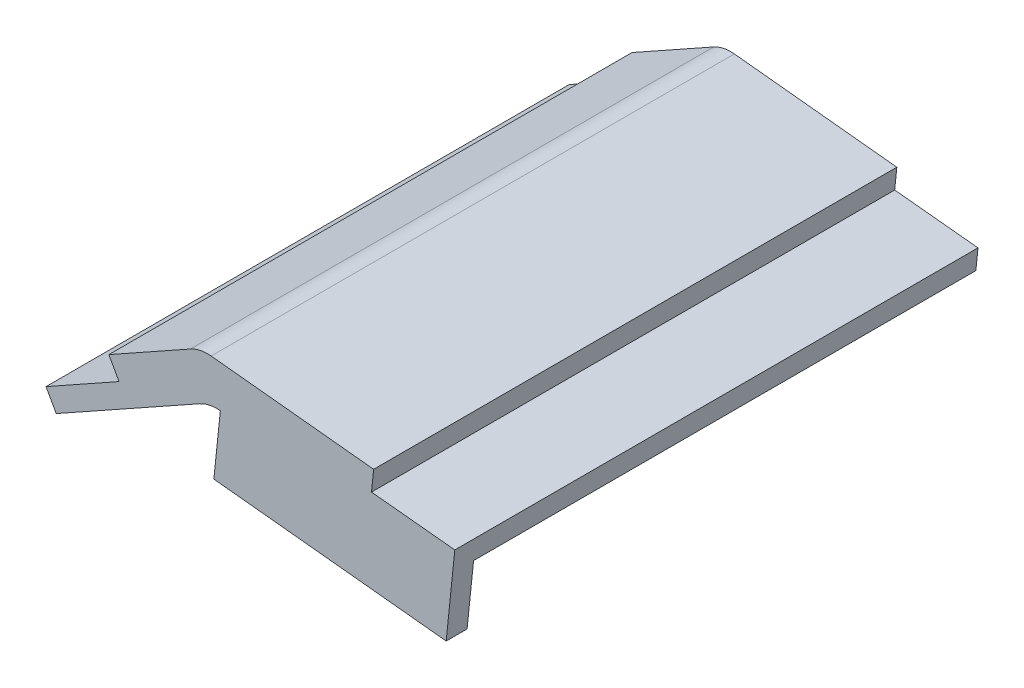
ISO-10303-21;
HEADER;
FILE_DESCRIPTION(('STEP AP214'),'2;1');
FILE_NAME('part.step','',(''),(''),'','','');
FILE_SCHEMA(('AUTOMOTIVE_DESIGN { 1 0 10303 214 1 1 1 1 }'));
ENDSEC;
DATA;
#1=APPLICATION_CONTEXT('core data for automotive mechanical design processes');
#2=APPLICATION_PROTOCOL_DEFINITION('international standard','automotive_design',2000,#1);
#3=PRODUCT_CONTEXT('',#1,'mechanical');
#4=PRODUCT('Part','Part','',(#3));
#5=PRODUCT_RELATED_PRODUCT_CATEGORY('part','',(#4));
#6=PRODUCT_DEFINITION_FORMATION('','',#4);
#7=PRODUCT_DEFINITION_CONTEXT('part definition',#1,'design');
#8=PRODUCT_DEFINITION('design','',#6,#7);
#9=PRODUCT_DEFINITION_SHAPE('','',#8);
#10=(LENGTH_UNIT() NAMED_UNIT(*) SI_UNIT(.MILLI.,.METRE.));
#11=(NAMED_UNIT(*) PLANE_ANGLE_UNIT() SI_UNIT($,.RADIAN.));
#12=(NAMED_UNIT(*) SI_UNIT($,.STERADIAN.) SOLID_ANGLE_UNIT());
#13=UNCERTAINTY_MEASURE_WITH_UNIT(LENGTH_MEASURE(1.E-05),#10,'distance_accuracy_value','');
#14=(GEOMETRIC_REPRESENTATION_CONTEXT(3) GLOBAL_UNCERTAINTY_ASSIGNED_CONTEXT((#13)) GLOBAL_UNIT_ASSIGNED_CONTEXT((#10,
#11,#12)) REPRESENTATION_CONTEXT('',''));
#15=CARTESIAN_POINT('',(0.,0.,0.));
#16=DIRECTION('',(0.,0.,1.));
#17=DIRECTION('',(1.,0.,0.));
#18=AXIS2_PLACEMENT_3D('',#15,#16,#17);
#19=CARTESIAN_POINT('',(27.5598014631692,14.6435706363407,75.));
#20=DIRECTION('',(0.103231615139367,0.994657344835757,0.));
#21=DIRECTION('',(-0.994657344835757,0.103231615139367,0.));
#22=AXIS2_PLACEMENT_3D('',#19,#20,#21);
#23=PLANE('',#22);
#24=DIRECTION('',(0.994657344835757,-0.103231615139367,0.));
#25=VECTOR('',#24,1.);
#26=CARTESIAN_POINT('',(27.5598014631692,14.6435706363407,72.));
#27=LINE('',#26,#25);
#28=CARTESIAN_POINT('',(27.5598014631692,14.6435706363407,72.));
#29=VERTEX_POINT('',#28);
#30=CARTESIAN_POINT('',(60.8607098876166,11.1873989405176,72.));
#31=VERTEX_POINT('',#30);
#32=EDGE_CURVE('E432',#29,#31,#27,.T.);
#33=ORIENTED_EDGE('',*,*,#32,.F.);
#34=DIRECTION('',(0.,0.,-1.));
#35=VECTOR('',#34,1.);
#36=CARTESIAN_POINT('',(27.5598014631692,14.6435706363407,75.));
#37=LINE('',#36,#35);
#38=CARTESIAN_POINT('',(27.5598014631692,14.6435706363407,0.));
#39=VERTEX_POINT('',#38);
#40=EDGE_CURVE('E214',#29,#39,#37,.T.);
#41=ORIENTED_EDGE('',*,*,#40,.T.);
#42=DIRECTION('',(0.994657344835757,-0.103231615139367,0.));
#43=VECTOR('',#42,1.);
#44=CARTESIAN_POINT('',(27.5598014631692,14.6435706363407,0.));
#45=LINE('',#44,#43);
#46=CARTESIAN_POINT('',(60.8607098876166,11.1873989405176,0.));
#47=VERTEX_POINT('',#46);
#48=EDGE_CURVE('E184',#39,#47,#45,.T.);
#49=ORIENTED_EDGE('',*,*,#48,.T.);
#50=DIRECTION('',(0.,0.,-1.));
#51=VECTOR('',#50,1.);
#52=CARTESIAN_POINT('',(60.8607098876166,11.1873989405176,75.));
#53=LINE('',#52,#51);
#54=EDGE_CURVE('E211',#31,#47,#53,.T.);
#55=ORIENTED_EDGE('',*,*,#54,.F.);
#56=EDGE_LOOP('',(#33,#41,#49,#55));
#57=FACE_BOUND('',#56,.T.);
#58=ADVANCED_FACE('F39',(#57),#23,.F.);
#59=CARTESIAN_POINT('',(11.575975538502,13.6218112800279,75.));
#60=DIRECTION('',(0.488204604461283,-0.872729204382896,0.));
#61=DIRECTION('',(0.872729204382896,0.488204604461283,0.));
#62=AXIS2_PLACEMENT_3D('',#59,#60,#61);
#63=PLANE('',#62);
#64=DIRECTION('',(-0.872729204382896,-0.488204604461283,0.));
#65=VECTOR('',#64,1.);
#66=CARTESIAN_POINT('',(11.575975538502,13.6218112800279,0.));
#67=LINE('',#66,#65);
#68=CARTESIAN_POINT('',(23.2848653572146,20.1717627356657,0.));
#69=VERTEX_POINT('',#68);
#70=CARTESIAN_POINT('',(11.575975538502,13.6218112800279,0.));
#71=VERTEX_POINT('',#70);
#72=EDGE_CURVE('E163',#69,#71,#67,.T.);
#73=ORIENTED_EDGE('',*,*,#72,.T.);
#74=DIRECTION('',(0.,0.,-1.));
#75=VECTOR('',#74,1.);
#76=CARTESIAN_POINT('',(11.575975538502,13.6218112800279,75.));
#77=LINE('',#76,#75);
#78=CARTESIAN_POINT('',(11.575975538502,13.6218112800279,75.));
#79=VERTEX_POINT('',#78);
#80=EDGE_CURVE('E11',#79,#71,#77,.T.);
#81=ORIENTED_EDGE('',*,*,#80,.F.);
#82=DIRECTION('',(-0.872729204382896,-0.488204604461283,0.));
#83=VECTOR('',#82,1.);
#84=CARTESIAN_POINT('',(11.575975538502,13.6218112800279,75.));
#85=LINE('',#84,#83);
#86=CARTESIAN_POINT('',(23.2848653572146,20.1717627356657,75.));
#87=VERTEX_POINT('',#86);
#88=EDGE_CURVE('E200',#87,#79,#85,.T.);
#89=ORIENTED_EDGE('',*,*,#88,.F.);
#90=DIRECTION('',(0.,0.,-1.));
#91=VECTOR('',#90,1.);
#92=CARTESIAN_POINT('',(23.2848653572146,20.1717627356657,75.));
#93=LINE('',#92,#91);
#94=EDGE_CURVE('E159',#87,#69,#93,.T.);
#95=ORIENTED_EDGE('',*,*,#94,.T.);
#96=EDGE_LOOP('',(#73,#81,#89,#95));
#97=FACE_BOUND('',#96,.T.);
#98=ADVANCED_FACE('F41',(#97),#63,.F.);
#99=CARTESIAN_POINT('',(11.575975538502,13.6218112800279,75.));
#100=DIRECTION('',(0.872729204382896,0.488204604461283,0.));
#101=DIRECTION('',(-0.488204604461283,0.872729204382896,0.));
#102=AXIS2_PLACEMENT_3D('',#99,#100,#101);
#103=PLANE('',#102);
#104=DIRECTION('',(0.488204604461283,-0.872729204382896,0.));
#105=VECTOR('',#104,1.);
#106=CARTESIAN_POINT('',(11.575975538502,13.6218112800279,0.));
#107=LINE('',#106,#105);
#108=CARTESIAN_POINT('',(13.0405893518858,11.0036236668792,0.));
#109=VERTEX_POINT('',#108);
#110=EDGE_CURVE('E167',#71,#109,#107,.T.);
#111=ORIENTED_EDGE('',*,*,#110,.T.);
#112=DIRECTION('',(0.,0.,-1.));
#113=VECTOR('',#112,1.);
#114=CARTESIAN_POINT('',(13.0405893518858,11.0036236668792,75.));
#115=LINE('',#114,#113);
#116=CARTESIAN_POINT('',(13.0405893518858,11.0036236668792,75.));
#117=VERTEX_POINT('',#116);
#118=EDGE_CURVE('E49',#117,#109,#115,.T.);
#119=ORIENTED_EDGE('',*,*,#118,.F.);
#120=DIRECTION('',(0.488204604461283,-0.872729204382896,0.));
#121=VECTOR('',#120,1.);
#122=CARTESIAN_POINT('',(11.575975538502,13.6218112800279,75.));
#123=LINE('',#122,#121);
#124=EDGE_CURVE('E113',#79,#117,#123,.T.);
#125=ORIENTED_EDGE('',*,*,#124,.F.);
#126=ORIENTED_EDGE('',*,*,#80,.T.);
#127=EDGE_LOOP('',(#111,#119,#125,#126));
#128=FACE_BOUND('',#127,.T.);
#129=ADVANCED_FACE('F302',(#128),#103,.F.);
#130=CARTESIAN_POINT('',(13.0405893518858,11.0036236668792,75.));
#131=DIRECTION('',(0.488204604461283,-0.872729204382896,0.));
#132=DIRECTION('',(0.872729204382896,0.488204604461283,0.));
#133=AXIS2_PLACEMENT_3D('',#130,#131,#132);
#134=PLANE('',#133);
#135=DIRECTION('',(-0.872729204382896,-0.488204604461283,0.));
#136=VECTOR('',#135,1.);
#137=CARTESIAN_POINT('',(13.0405893518858,11.0036236668792,0.));
#138=LINE('',#137,#136);
#139=CARTESIAN_POINT('',(2.56783889929108,5.14516841334378,0.));
#140=VERTEX_POINT('',#139);
#141=EDGE_CURVE('E171',#109,#140,#138,.T.);
#142=ORIENTED_EDGE('',*,*,#141,.T.);
#143=DIRECTION('',(0.,0.,-1.));
#144=VECTOR('',#143,1.);
#145=CARTESIAN_POINT('',(2.56783889929108,5.14516841334378,75.));
#146=LINE('',#145,#144);
#147=CARTESIAN_POINT('',(2.56783889929108,5.14516841334378,75.));
#148=VERTEX_POINT('',#147);
#149=EDGE_CURVE('E227',#148,#140,#146,.T.);
#150=ORIENTED_EDGE('',*,*,#149,.F.);
#151=DIRECTION('',(-0.872729204382896,-0.488204604461283,0.));
#152=VECTOR('',#151,1.);
#153=CARTESIAN_POINT('',(13.0405893518858,11.0036236668792,75.));
#154=LINE('',#153,#152);
#155=EDGE_CURVE('E237',#117,#148,#154,.T.);
#156=ORIENTED_EDGE('',*,*,#155,.F.);
#157=ORIENTED_EDGE('',*,*,#118,.T.);
#158=EDGE_LOOP('',(#142,#150,#156,#157));
#159=FACE_BOUND('',#158,.T.);
#160=ADVANCED_FACE('F235',(#159),#134,.F.);
#161=CARTESIAN_POINT('',(2.56783889929108,5.14516841334378,75.));
#162=DIRECTION('',(0.872729204382901,0.488204604461273,0.));
#163=DIRECTION('',(-0.488204604461273,0.872729204382901,0.));
#164=AXIS2_PLACEMENT_3D('',#161,#162,#163);
#165=PLANE('',#164);
#166=DIRECTION('',(0.488204604461273,-0.872729204382901,0.));
#167=VECTOR('',#166,1.);
#168=CARTESIAN_POINT('',(2.56783889929108,5.14516841334378,0.));
#169=LINE('',#168,#167);
#170=CARTESIAN_POINT('',(4.0324527126749,2.52698080019508,0.));
#171=VERTEX_POINT('',#170);
#172=EDGE_CURVE('E174',#140,#171,#169,.T.);
#173=ORIENTED_EDGE('',*,*,#172,.T.);
#174=DIRECTION('',(0.,0.,-1.));
#175=VECTOR('',#174,1.);
#176=CARTESIAN_POINT('',(4.0324527126749,2.52698080019508,75.));
#177=LINE('',#176,#175);
#178=CARTESIAN_POINT('',(4.0324527126749,2.52698080019508,75.));
#179=VERTEX_POINT('',#178);
#180=EDGE_CURVE('E223',#179,#171,#177,.T.);
#181=ORIENTED_EDGE('',*,*,#180,.F.);
#182=DIRECTION('',(0.488204604461273,-0.872729204382901,0.));
#183=VECTOR('',#182,1.);
#184=CARTESIAN_POINT('',(2.56783889929108,5.14516841334378,75.));
#185=LINE('',#184,#183);
#186=EDGE_CURVE('E257',#148,#179,#185,.T.);
#187=ORIENTED_EDGE('',*,*,#186,.F.);
#188=ORIENTED_EDGE('',*,*,#149,.T.);
#189=EDGE_LOOP('',(#173,#181,#187,#188));
#190=FACE_BOUND('',#189,.T.);
#191=ADVANCED_FACE('F246',(#190),#165,.F.);
#192=CARTESIAN_POINT('',(4.0324527126749,2.52698080019508,75.));
#193=DIRECTION('',(-0.488204604461283,0.872729204382895,0.));
#194=DIRECTION('',(-0.872729204382895,-0.488204604461283,0.));
#195=AXIS2_PLACEMENT_3D('',#192,#193,#194);
#196=PLANE('',#195);
#197=DIRECTION('',(0.872729204382895,0.488204604461283,0.));
#198=VECTOR('',#197,1.);
#199=CARTESIAN_POINT('',(4.0324527126749,2.52698080019508,0.));
#200=LINE('',#199,#198);
#201=CARTESIAN_POINT('',(24.602620365166,14.0339299340764,0.));
#202=VERTEX_POINT('',#201);
#203=EDGE_CURVE('E177',#171,#202,#200,.T.);
#204=ORIENTED_EDGE('',*,*,#203,.T.);
#205=DIRECTION('',(0.,0.,-1.));
#206=VECTOR('',#205,1.);
#207=CARTESIAN_POINT('',(24.602620365166,14.0339299340764,75.));
#208=LINE('',#207,#206);
#209=CARTESIAN_POINT('',(24.602620365166,14.0339299340764,75.));
#210=VERTEX_POINT('',#209);
#211=EDGE_CURVE('E219',#210,#202,#208,.T.);
#212=ORIENTED_EDGE('',*,*,#211,.F.);
#213=DIRECTION('',(0.872729204382895,0.488204604461283,0.));
#214=VECTOR('',#213,1.);
#215=CARTESIAN_POINT('',(4.0324527126749,2.52698080019508,75.));
#216=LINE('',#215,#214);
#217=EDGE_CURVE('E252',#179,#210,#216,.T.);
#218=ORIENTED_EDGE('',*,*,#217,.F.);
#219=ORIENTED_EDGE('',*,*,#180,.T.);
#220=EDGE_LOOP('',(#204,#212,#218,#219));
#221=FACE_BOUND('',#220,.T.);
#222=ADVANCED_FACE('F250',(#221),#196,.F.);
#223=CARTESIAN_POINT('',(27.0436433874724,9.67028391216185,75.));
#224=DIRECTION('',(0.,0.,-1.));
#225=DIRECTION('',(-1.,0.,0.));
#226=AXIS2_PLACEMENT_3D('',#223,#224,#225);
#227=CYLINDRICAL_SURFACE('',#226,5.00000000000006);
#228=CARTESIAN_POINT('',(27.0436433874724,9.67028391216185,0.));
#229=DIRECTION('',(0.,0.,-1.));
#230=DIRECTION('',(1.,0.,0.));
#231=AXIS2_PLACEMENT_3D('',#228,#229,#230);
#232=CIRCLE('',#231,5.00000000000006);
#233=EDGE_CURVE('E180',#202,#39,#232,.T.);
#234=ORIENTED_EDGE('',*,*,#233,.T.);
#235=ORIENTED_EDGE('',*,*,#40,.F.);
#236=CARTESIAN_POINT('',(27.5598014631692,14.6435706363407,75.));
#237=VERTEX_POINT('',#236);
#238=EDGE_CURVE('E215',#237,#29,#37,.T.);
#239=ORIENTED_EDGE('',*,*,#238,.F.);
#240=CARTESIAN_POINT('',(27.0436433874724,9.67028391216185,75.));
#241=DIRECTION('',(0.,0.,-1.));
#242=DIRECTION('',(1.,0.,0.));
#243=AXIS2_PLACEMENT_3D('',#240,#241,#242);
#244=CIRCLE('',#243,5.00000000000006);
#245=EDGE_CURVE('E256',#210,#237,#244,.T.);
#246=ORIENTED_EDGE('',*,*,#245,.F.);
#247=ORIENTED_EDGE('',*,*,#211,.T.);
#248=EDGE_LOOP('',(#234,#235,#239,#246,#247));
#249=FACE_BOUND('',#248,.T.);
#250=ADVANCED_FACE('F307',(#249),#227,.F.);
#251=CARTESIAN_POINT('',(61.1704047330347,14.1713709750249,75.));
#252=DIRECTION('',(-0.994657344835757,0.103231615139368,0.));
#253=DIRECTION('',(-0.103231615139368,-0.994657344835757,0.));
#254=AXIS2_PLACEMENT_3D('',#251,#252,#253);
#255=PLANE('',#254);
#256=DIRECTION('',(0.103231615139368,0.994657344835757,0.));
#257=VECTOR('',#256,1.);
#258=CARTESIAN_POINT('',(61.1704047330347,14.1713709750249,0.));
#259=LINE('',#258,#257);
#260=CARTESIAN_POINT('',(61.1704047330347,14.1713709750249,0.));
#261=VERTEX_POINT('',#260);
#262=EDGE_CURVE('E188',#47,#261,#259,.T.);
#263=ORIENTED_EDGE('',*,*,#262,.T.);
#264=DIRECTION('',(0.,0.,-1.));
#265=VECTOR('',#264,1.);
#266=CARTESIAN_POINT('',(61.1704047330347,14.1713709750249,75.));
#267=LINE('',#266,#265);
#268=CARTESIAN_POINT('',(61.1704047330347,14.1713709750249,75.));
#269=VERTEX_POINT('',#268);
#270=EDGE_CURVE('E207',#269,#261,#267,.T.);
#271=ORIENTED_EDGE('',*,*,#270,.F.);
#272=DIRECTION('',(0.103231615139368,0.994657344835757,0.));
#273=VECTOR('',#272,1.);
#274=CARTESIAN_POINT('',(61.1704047330347,14.1713709750249,75.));
#275=LINE('',#274,#273);
#276=CARTESIAN_POINT('',(59.9316253513623,2.23548283699584,75.));
#277=VERTEX_POINT('',#276);
#278=EDGE_CURVE('E261',#277,#269,#275,.T.);
#279=ORIENTED_EDGE('',*,*,#278,.F.);
#280=DIRECTION('',(0.,0.,1.));
#281=VECTOR('',#280,1.);
#282=CARTESIAN_POINT('',(59.9316253513623,2.23548283699584,75.));
#283=LINE('',#282,#281);
#284=CARTESIAN_POINT('',(59.9316253513623,2.23548283699584,72.));
#285=VERTEX_POINT('',#284);
#286=EDGE_CURVE('E457',#285,#277,#283,.T.);
#287=ORIENTED_EDGE('',*,*,#286,.F.);
#288=DIRECTION('',(0.103231615139367,0.994657344835757,0.));
#289=VECTOR('',#288,1.);
#290=CARTESIAN_POINT('',(59.9316253513623,2.23548283699584,72.));
#291=LINE('',#290,#289);
#292=EDGE_CURVE('E439',#285,#31,#291,.T.);
#293=ORIENTED_EDGE('',*,*,#292,.T.);
#294=ORIENTED_EDGE('',*,*,#54,.T.);
#295=EDGE_LOOP('',(#263,#271,#279,#287,#293,#294));
#296=FACE_BOUND('',#295,.T.);
#297=ADVANCED_FACE('F278',(#296),#255,.F.);
#298=CARTESIAN_POINT('',(49.2313579036183,15.3793282611088,75.));
#299=DIRECTION('',(-0.100663107173661,-0.99492056911803,0.));
#300=DIRECTION('',(0.99492056911803,-0.100663107173661,0.));
#301=AXIS2_PLACEMENT_3D('',#298,#299,#300);
#302=PLANE('',#301);
#303=DIRECTION('',(-0.99492056911803,0.100663107173661,0.));
#304=VECTOR('',#303,1.);
#305=CARTESIAN_POINT('',(49.2313579036183,15.3793282611088,0.));
#306=LINE('',#305,#304);
#307=CARTESIAN_POINT('',(49.2313579036183,15.3793282611088,0.));
#308=VERTEX_POINT('',#307);
#309=EDGE_CURVE('E191',#261,#308,#306,.T.);
#310=ORIENTED_EDGE('',*,*,#309,.T.);
#311=DIRECTION('',(0.,0.,-1.));
#312=VECTOR('',#311,1.);
#313=CARTESIAN_POINT('',(49.2313579036183,15.3793282611088,75.));
#314=LINE('',#313,#312);
#315=CARTESIAN_POINT('',(49.2313579036183,15.3793282611088,75.));
#316=VERTEX_POINT('',#315);
#317=EDGE_CURVE('E152',#316,#308,#314,.T.);
#318=ORIENTED_EDGE('',*,*,#317,.F.);
#319=DIRECTION('',(-0.99492056911803,0.100663107173661,0.));
#320=VECTOR('',#319,1.);
#321=CARTESIAN_POINT('',(49.2313579036183,15.3793282611088,75.));
#322=LINE('',#321,#320);
#323=EDGE_CURVE('E141',#269,#316,#322,.T.);
#324=ORIENTED_EDGE('',*,*,#323,.F.);
#325=ORIENTED_EDGE('',*,*,#270,.T.);
#326=EDGE_LOOP('',(#310,#318,#324,#325));
#327=FACE_BOUND('',#326,.T.);
#328=ADVANCED_FACE('F282',(#327),#302,.F.);
#329=CARTESIAN_POINT('',(49.5333472251393,18.3640899684629,75.));
#330=DIRECTION('',(-0.99492056911803,0.100663107173662,0.));
#331=DIRECTION('',(-0.100663107173662,-0.99492056911803,0.));
#332=AXIS2_PLACEMENT_3D('',#329,#330,#331);
#333=PLANE('',#332);
#334=DIRECTION('',(0.100663107173662,0.99492056911803,0.));
#335=VECTOR('',#334,1.);
#336=CARTESIAN_POINT('',(49.5333472251393,18.3640899684629,0.));
#337=LINE('',#336,#335);
#338=CARTESIAN_POINT('',(49.5333472251393,18.3640899684629,0.));
#339=VERTEX_POINT('',#338);
#340=EDGE_CURVE('E150',#308,#339,#337,.T.);
#341=ORIENTED_EDGE('',*,*,#340,.T.);
#342=DIRECTION('',(0.,0.,-1.));
#343=VECTOR('',#342,1.);
#344=CARTESIAN_POINT('',(49.5333472251393,18.3640899684629,75.));
#345=LINE('',#344,#343);
#346=CARTESIAN_POINT('',(49.5333472251393,18.3640899684629,75.));
#347=VERTEX_POINT('',#346);
#348=EDGE_CURVE('E147',#347,#339,#345,.T.);
#349=ORIENTED_EDGE('',*,*,#348,.F.);
#350=DIRECTION('',(0.100663107173662,0.99492056911803,0.));
#351=VECTOR('',#350,1.);
#352=CARTESIAN_POINT('',(49.5333472251393,18.3640899684629,75.));
#353=LINE('',#352,#351);
#354=EDGE_CURVE('E135',#316,#347,#353,.T.);
#355=ORIENTED_EDGE('',*,*,#354,.F.);
#356=ORIENTED_EDGE('',*,*,#317,.T.);
#357=EDGE_LOOP('',(#341,#349,#355,#356));
#358=FACE_BOUND('',#357,.T.);
#359=ADVANCED_FACE('F148',(#358),#333,.F.);
#360=CARTESIAN_POINT('',(26.2420464552179,20.7814034379299,75.));
#361=DIRECTION('',(-0.103231615139367,-0.994657344835757,0.));
#362=DIRECTION('',(0.994657344835757,-0.103231615139367,0.));
#363=AXIS2_PLACEMENT_3D('',#360,#361,#362);
#364=PLANE('',#363);
#365=DIRECTION('',(-0.994657344835757,0.103231615139367,0.));
#366=VECTOR('',#365,1.);
#367=CARTESIAN_POINT('',(26.2420464552179,20.7814034379299,0.));
#368=LINE('',#367,#366);
#369=CARTESIAN_POINT('',(26.2420464552179,20.7814034379299,0.));
#370=VERTEX_POINT('',#369);
#371=EDGE_CURVE('E99',#339,#370,#368,.T.);
#372=ORIENTED_EDGE('',*,*,#371,.T.);
#373=DIRECTION('',(0.,0.,-1.));
#374=VECTOR('',#373,1.);
#375=CARTESIAN_POINT('',(26.2420464552179,20.7814034379299,75.));
#376=LINE('',#375,#374);
#377=CARTESIAN_POINT('',(26.2420464552179,20.7814034379299,75.));
#378=VERTEX_POINT('',#377);
#379=EDGE_CURVE('E153',#378,#370,#376,.T.);
#380=ORIENTED_EDGE('',*,*,#379,.F.);
#381=DIRECTION('',(-0.994657344835757,0.103231615139367,0.));
#382=VECTOR('',#381,1.);
#383=CARTESIAN_POINT('',(26.2420464552179,20.7814034379299,75.));
#384=LINE('',#383,#382);
#385=EDGE_CURVE('E139',#347,#378,#384,.T.);
#386=ORIENTED_EDGE('',*,*,#385,.F.);
#387=ORIENTED_EDGE('',*,*,#348,.T.);
#388=EDGE_LOOP('',(#372,#380,#386,#387));
#389=FACE_BOUND('',#388,.T.);
#390=ADVANCED_FACE('F155',(#389),#364,.F.);
#391=CARTESIAN_POINT('',(25.725888379521,15.8081167137511,75.));
#392=DIRECTION('',(0.,0.,-1.));
#393=DIRECTION('',(-1.,0.,0.));
#394=AXIS2_PLACEMENT_3D('',#391,#392,#393);
#395=CYLINDRICAL_SURFACE('',#394,5.00000000000006);
#396=CARTESIAN_POINT('',(25.725888379521,15.8081167137511,0.));
#397=DIRECTION('',(0.,0.,1.));
#398=DIRECTION('',(1.,0.,0.));
#399=AXIS2_PLACEMENT_3D('',#396,#397,#398);
#400=CIRCLE('',#399,5.00000000000006);
#401=EDGE_CURVE('E105',#370,#69,#400,.T.);
#402=ORIENTED_EDGE('',*,*,#401,.T.);
#403=ORIENTED_EDGE('',*,*,#94,.F.);
#404=CARTESIAN_POINT('',(25.725888379521,15.8081167137511,75.));
#405=DIRECTION('',(0.,0.,1.));
#406=DIRECTION('',(1.,0.,0.));
#407=AXIS2_PLACEMENT_3D('',#404,#405,#406);
#408=CIRCLE('',#407,5.00000000000006);
#409=EDGE_CURVE('E57',#378,#87,#408,.T.);
#410=ORIENTED_EDGE('',*,*,#409,.F.);
#411=ORIENTED_EDGE('',*,*,#379,.T.);
#412=EDGE_LOOP('',(#402,#403,#410,#411));
#413=FACE_BOUND('',#412,.T.);
#414=ADVANCED_FACE('F286',(#413),#395,.T.);
#415=CARTESIAN_POINT('',(25.725888379521,15.8081167137511,75.));
#416=DIRECTION('',(0.,0.,1.));
#417=DIRECTION('',(1.,0.,0.));
#418=AXIS2_PLACEMENT_3D('',#415,#416,#417);
#419=PLANE('',#418);
#420=ORIENTED_EDGE('',*,*,#88,.T.);
#421=ORIENTED_EDGE('',*,*,#124,.T.);
#422=ORIENTED_EDGE('',*,*,#155,.T.);
#423=ORIENTED_EDGE('',*,*,#186,.T.);
#424=ORIENTED_EDGE('',*,*,#217,.T.);
#425=ORIENTED_EDGE('',*,*,#245,.T.);
#426=DIRECTION('',(0.103231615139367,0.994657344835757,0.));
#427=VECTOR('',#426,1.);
#428=CARTESIAN_POINT('',(26.6307169269149,5.6916545328189,75.));
#429=LINE('',#428,#427);
#430=CARTESIAN_POINT('',(26.6307169269149,5.6916545328189,75.));
#431=VERTEX_POINT('',#430);
#432=EDGE_CURVE('E443',#431,#237,#429,.T.);
#433=ORIENTED_EDGE('',*,*,#432,.F.);
#434=DIRECTION('',(-0.994657344835757,0.103231615139367,0.));
#435=VECTOR('',#434,1.);
#436=CARTESIAN_POINT('',(26.6307169269149,5.6916545328189,75.));
#437=LINE('',#436,#435);
#438=EDGE_CURVE('E274',#277,#431,#437,.T.);
#439=ORIENTED_EDGE('',*,*,#438,.F.);
#440=ORIENTED_EDGE('',*,*,#278,.T.);
#441=ORIENTED_EDGE('',*,*,#323,.T.);
#442=ORIENTED_EDGE('',*,*,#354,.T.);
#443=ORIENTED_EDGE('',*,*,#385,.T.);
#444=ORIENTED_EDGE('',*,*,#409,.T.);
#445=EDGE_LOOP('',(#420,#421,#422,#423,#424,#425,#433,#439,#440,#441,#442,#443,#444));
#446=FACE_BOUND('',#445,.T.);
#447=ADVANCED_FACE('F137',(#446),#419,.T.);
#448=CARTESIAN_POINT('',(25.725888379521,15.8081167137511,0.));
#449=DIRECTION('',(0.,0.,1.));
#450=DIRECTION('',(1.,0.,0.));
#451=AXIS2_PLACEMENT_3D('',#448,#449,#450);
#452=PLANE('',#451);
#453=ORIENTED_EDGE('',*,*,#72,.F.);
#454=ORIENTED_EDGE('',*,*,#401,.F.);
#455=ORIENTED_EDGE('',*,*,#371,.F.);
#456=ORIENTED_EDGE('',*,*,#340,.F.);
#457=ORIENTED_EDGE('',*,*,#309,.F.);
#458=ORIENTED_EDGE('',*,*,#262,.F.);
#459=ORIENTED_EDGE('',*,*,#48,.F.);
#460=ORIENTED_EDGE('',*,*,#233,.F.);
#461=ORIENTED_EDGE('',*,*,#203,.F.);
#462=ORIENTED_EDGE('',*,*,#172,.F.);
#463=ORIENTED_EDGE('',*,*,#141,.F.);
#464=ORIENTED_EDGE('',*,*,#110,.F.);
#465=EDGE_LOOP('',(#453,#454,#455,#456,#457,#458,#459,#460,#461,#462,#463,#464));
#466=FACE_BOUND('',#465,.T.);
#467=ADVANCED_FACE('F241',(#466),#452,.F.);
#468=CARTESIAN_POINT('',(26.6307169269149,5.6916545328189,75.));
#469=DIRECTION('',(0.994657344835757,-0.103231615139367,0.));
#470=DIRECTION('',(0.103231615139367,0.994657344835757,0.));
#471=AXIS2_PLACEMENT_3D('',#468,#469,#470);
#472=PLANE('',#471);
#473=ORIENTED_EDGE('',*,*,#238,.T.);
#474=DIRECTION('',(0.103231615139367,0.994657344835757,0.));
#475=VECTOR('',#474,1.);
#476=CARTESIAN_POINT('',(26.6307169269149,5.6916545328189,72.));
#477=LINE('',#476,#475);
#478=CARTESIAN_POINT('',(26.6307169269149,5.6916545328189,72.));
#479=VERTEX_POINT('',#478);
#480=EDGE_CURVE('E168',#479,#29,#477,.T.);
#481=ORIENTED_EDGE('',*,*,#480,.F.);
#482=DIRECTION('',(0.,0.,-1.));
#483=VECTOR('',#482,1.);
#484=CARTESIAN_POINT('',(26.6307169269149,5.6916545328189,75.));
#485=LINE('',#484,#483);
#486=EDGE_CURVE('E423',#431,#479,#485,.T.);
#487=ORIENTED_EDGE('',*,*,#486,.F.);
#488=ORIENTED_EDGE('',*,*,#432,.T.);
#489=EDGE_LOOP('',(#473,#481,#487,#488));
#490=FACE_BOUND('',#489,.T.);
#491=ADVANCED_FACE('F371',(#490),#472,.F.);
#492=CARTESIAN_POINT('',(26.6307169269149,5.6916545328189,72.));
#493=DIRECTION('',(0.,0.,1.));
#494=DIRECTION('',(1.,0.,0.));
#495=AXIS2_PLACEMENT_3D('',#492,#493,#494);
#496=PLANE('',#495);
#497=ORIENTED_EDGE('',*,*,#32,.T.);
#498=ORIENTED_EDGE('',*,*,#292,.F.);
#499=DIRECTION('',(0.994657344835757,-0.103231615139367,0.));
#500=VECTOR('',#499,1.);
#501=CARTESIAN_POINT('',(26.6307169269149,5.6916545328189,72.));
#502=LINE('',#501,#500);
#503=EDGE_CURVE('E427',#479,#285,#502,.T.);
#504=ORIENTED_EDGE('',*,*,#503,.F.);
#505=ORIENTED_EDGE('',*,*,#480,.T.);
#506=EDGE_LOOP('',(#497,#498,#504,#505));
#507=FACE_BOUND('',#506,.T.);
#508=ADVANCED_FACE('F396',(#507),#496,.F.);
#509=CARTESIAN_POINT('',(0.868216895170971,8.36544415706792,0.));
#510=DIRECTION('',(-0.103231615139367,-0.994657344835757,0.));
#511=DIRECTION('',(0.994657344835757,-0.103231615139367,0.));
#512=AXIS2_PLACEMENT_3D('',#509,#510,#511);
#513=PLANE('',#512);
#514=ORIENTED_EDGE('',*,*,#486,.T.);
#515=ORIENTED_EDGE('',*,*,#503,.T.);
#516=ORIENTED_EDGE('',*,*,#286,.T.);
#517=ORIENTED_EDGE('',*,*,#438,.T.);
#518=EDGE_LOOP('',(#514,#515,#516,#517));
#519=FACE_BOUND('',#518,.T.);
#520=ADVANCED_FACE('F405',(#519),#513,.T.);
#521=CLOSED_SHELL('',(#58,#98,#129,#160,#191,#222,#250,#297,#328,#359,#390,#414,#447,#467,#491,
#508,#520));
#522=MANIFOLD_SOLID_BREP('B2',#521);
#523=ADVANCED_BREP_SHAPE_REPRESENTATION('',(#18,#522),#14);
#524=SHAPE_DEFINITION_REPRESENTATION(#9,#523);
ENDSEC;
END-ISO-10303-21;
